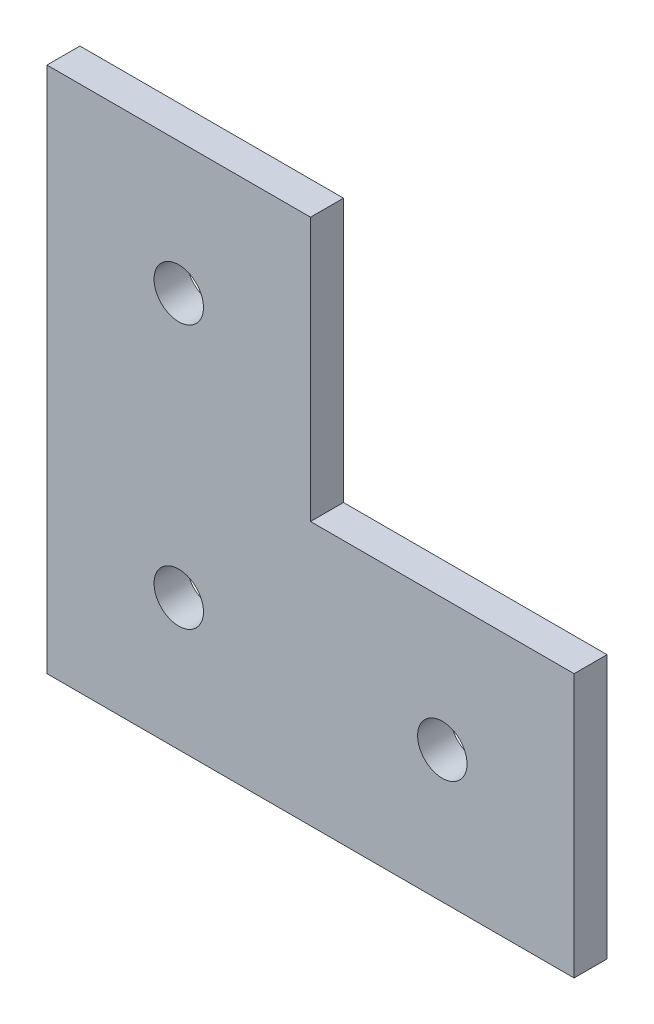
ISO-10303-21;
HEADER;
FILE_DESCRIPTION(('STEP AP214'),'2;1');
FILE_NAME('part.step','',(''),(''),'','','');
FILE_SCHEMA(('AUTOMOTIVE_DESIGN { 1 0 10303 214 1 1 1 1 }'));
ENDSEC;
DATA;
#1=APPLICATION_CONTEXT('core data for automotive mechanical design processes');
#2=APPLICATION_PROTOCOL_DEFINITION('international standard','automotive_design',2000,#1);
#3=PRODUCT_CONTEXT('',#1,'mechanical');
#4=PRODUCT('Part','Part','',(#3));
#5=PRODUCT_RELATED_PRODUCT_CATEGORY('part','',(#4));
#6=PRODUCT_DEFINITION_FORMATION('','',#4);
#7=PRODUCT_DEFINITION_CONTEXT('part definition',#1,'design');
#8=PRODUCT_DEFINITION('design','',#6,#7);
#9=PRODUCT_DEFINITION_SHAPE('','',#8);
#10=(LENGTH_UNIT() NAMED_UNIT(*) SI_UNIT(.MILLI.,.METRE.));
#11=(NAMED_UNIT(*) PLANE_ANGLE_UNIT() SI_UNIT($,.RADIAN.));
#12=(NAMED_UNIT(*) SI_UNIT($,.STERADIAN.) SOLID_ANGLE_UNIT());
#13=UNCERTAINTY_MEASURE_WITH_UNIT(LENGTH_MEASURE(1.E-05),#10,'distance_accuracy_value','');
#14=(GEOMETRIC_REPRESENTATION_CONTEXT(3) GLOBAL_UNCERTAINTY_ASSIGNED_CONTEXT((#13)) GLOBAL_UNIT_ASSIGNED_CONTEXT((#10,
#11,#12)) REPRESENTATION_CONTEXT('',''));
#15=CARTESIAN_POINT('',(0.,0.,0.));
#16=DIRECTION('',(0.,0.,1.));
#17=DIRECTION('',(1.,0.,0.));
#18=AXIS2_PLACEMENT_3D('',#15,#16,#17);
#19=CARTESIAN_POINT('',(25.4,0.,3.175));
#20=DIRECTION('',(1.,0.,0.));
#21=DIRECTION('',(0.,1.,0.));
#22=AXIS2_PLACEMENT_3D('',#19,#20,#21);
#23=PLANE('',#22);
#24=DIRECTION('',(0.,-1.,0.));
#25=VECTOR('',#24,1.);
#26=CARTESIAN_POINT('',(25.4,0.,0.));
#27=LINE('',#26,#25);
#28=CARTESIAN_POINT('',(25.4,50.8,0.));
#29=VERTEX_POINT('',#28);
#30=CARTESIAN_POINT('',(25.4,25.4,0.));
#31=VERTEX_POINT('',#30);
#32=EDGE_CURVE('E133',#29,#31,#27,.T.);
#33=ORIENTED_EDGE('',*,*,#32,.F.);
#34=DIRECTION('',(0.,0.,-1.));
#35=VECTOR('',#34,1.);
#36=CARTESIAN_POINT('',(25.4,50.8,3.175));
#37=LINE('',#36,#35);
#38=CARTESIAN_POINT('',(25.4,50.8,3.175));
#39=VERTEX_POINT('',#38);
#40=EDGE_CURVE('E11',#39,#29,#37,.T.);
#41=ORIENTED_EDGE('',*,*,#40,.F.);
#42=DIRECTION('',(0.,-1.,0.));
#43=VECTOR('',#42,1.);
#44=CARTESIAN_POINT('',(25.4,0.,3.175));
#45=LINE('',#44,#43);
#46=CARTESIAN_POINT('',(25.4,25.4,3.175));
#47=VERTEX_POINT('',#46);
#48=EDGE_CURVE('E279',#39,#47,#45,.T.);
#49=ORIENTED_EDGE('',*,*,#48,.T.);
#50=DIRECTION('',(0.,0.,-1.));
#51=VECTOR('',#50,1.);
#52=CARTESIAN_POINT('',(25.4,25.4,3.175));
#53=LINE('',#52,#51);
#54=EDGE_CURVE('E83',#47,#31,#53,.T.);
#55=ORIENTED_EDGE('',*,*,#54,.T.);
#56=EDGE_LOOP('',(#33,#41,#49,#55));
#57=FACE_BOUND('',#56,.T.);
#58=ADVANCED_FACE('F38',(#57),#23,.T.);
#59=CARTESIAN_POINT('',(0.,50.8,3.175));
#60=DIRECTION('',(0.,1.,0.));
#61=DIRECTION('',(0.,0.,1.));
#62=AXIS2_PLACEMENT_3D('',#59,#60,#61);
#63=PLANE('',#62);
#64=DIRECTION('',(1.,0.,0.));
#65=VECTOR('',#64,1.);
#66=CARTESIAN_POINT('',(0.,50.8,0.));
#67=LINE('',#66,#65);
#68=CARTESIAN_POINT('',(0.,50.8,0.));
#69=VERTEX_POINT('',#68);
#70=EDGE_CURVE('E131',#69,#29,#67,.T.);
#71=ORIENTED_EDGE('',*,*,#70,.F.);
#72=DIRECTION('',(0.,0.,-1.));
#73=VECTOR('',#72,1.);
#74=CARTESIAN_POINT('',(0.,50.8,3.175));
#75=LINE('',#74,#73);
#76=CARTESIAN_POINT('',(0.,50.8,3.175));
#77=VERTEX_POINT('',#76);
#78=EDGE_CURVE('E47',#77,#69,#75,.T.);
#79=ORIENTED_EDGE('',*,*,#78,.F.);
#80=DIRECTION('',(1.,0.,0.));
#81=VECTOR('',#80,1.);
#82=CARTESIAN_POINT('',(0.,50.8,3.175));
#83=LINE('',#82,#81);
#84=EDGE_CURVE('E280',#77,#39,#83,.T.);
#85=ORIENTED_EDGE('',*,*,#84,.T.);
#86=ORIENTED_EDGE('',*,*,#40,.T.);
#87=EDGE_LOOP('',(#71,#79,#85,#86));
#88=FACE_BOUND('',#87,.T.);
#89=ADVANCED_FACE('F132',(#88),#63,.T.);
#90=CARTESIAN_POINT('',(0.,0.,3.175));
#91=DIRECTION('',(-1.,0.,0.));
#92=DIRECTION('',(0.,0.,1.));
#93=AXIS2_PLACEMENT_3D('',#90,#91,#92);
#94=PLANE('',#93);
#95=DIRECTION('',(0.,1.,0.));
#96=VECTOR('',#95,1.);
#97=CARTESIAN_POINT('',(0.,0.,0.));
#98=LINE('',#97,#96);
#99=CARTESIAN_POINT('',(0.,0.,0.));
#100=VERTEX_POINT('',#99);
#101=EDGE_CURVE('E127',#100,#69,#98,.T.);
#102=ORIENTED_EDGE('',*,*,#101,.F.);
#103=DIRECTION('',(0.,0.,-1.));
#104=VECTOR('',#103,1.);
#105=CARTESIAN_POINT('',(0.,0.,3.175));
#106=LINE('',#105,#104);
#107=CARTESIAN_POINT('',(0.,0.,3.175));
#108=VERTEX_POINT('',#107);
#109=EDGE_CURVE('E117',#108,#100,#106,.T.);
#110=ORIENTED_EDGE('',*,*,#109,.F.);
#111=DIRECTION('',(0.,1.,0.));
#112=VECTOR('',#111,1.);
#113=CARTESIAN_POINT('',(0.,0.,3.175));
#114=LINE('',#113,#112);
#115=EDGE_CURVE('E111',#108,#77,#114,.T.);
#116=ORIENTED_EDGE('',*,*,#115,.T.);
#117=ORIENTED_EDGE('',*,*,#78,.T.);
#118=EDGE_LOOP('',(#102,#110,#116,#117));
#119=FACE_BOUND('',#118,.T.);
#120=ADVANCED_FACE('F125',(#119),#94,.T.);
#121=CARTESIAN_POINT('',(0.,0.,3.175));
#122=DIRECTION('',(0.,1.,0.));
#123=DIRECTION('',(0.,0.,1.));
#124=AXIS2_PLACEMENT_3D('',#121,#122,#123);
#125=PLANE('',#124);
#126=DIRECTION('',(1.,0.,0.));
#127=VECTOR('',#126,1.);
#128=CARTESIAN_POINT('',(0.,0.,0.));
#129=LINE('',#128,#127);
#130=CARTESIAN_POINT('',(50.8,0.,0.));
#131=VERTEX_POINT('',#130);
#132=EDGE_CURVE('E116',#100,#131,#129,.T.);
#133=ORIENTED_EDGE('',*,*,#132,.T.);
#134=DIRECTION('',(0.,0.,-1.));
#135=VECTOR('',#134,1.);
#136=CARTESIAN_POINT('',(50.8,0.,3.175));
#137=LINE('',#136,#135);
#138=CARTESIAN_POINT('',(50.8,0.,3.175));
#139=VERTEX_POINT('',#138);
#140=EDGE_CURVE('E101',#139,#131,#137,.T.);
#141=ORIENTED_EDGE('',*,*,#140,.F.);
#142=DIRECTION('',(1.,0.,0.));
#143=VECTOR('',#142,1.);
#144=CARTESIAN_POINT('',(0.,0.,3.175));
#145=LINE('',#144,#143);
#146=EDGE_CURVE('E104',#108,#139,#145,.T.);
#147=ORIENTED_EDGE('',*,*,#146,.F.);
#148=ORIENTED_EDGE('',*,*,#109,.T.);
#149=EDGE_LOOP('',(#133,#141,#147,#148));
#150=FACE_BOUND('',#149,.T.);
#151=ADVANCED_FACE('F114',(#150),#125,.F.);
#152=CARTESIAN_POINT('',(50.8,0.,3.175));
#153=DIRECTION('',(-1.,0.,0.));
#154=DIRECTION('',(0.,0.,1.));
#155=AXIS2_PLACEMENT_3D('',#152,#153,#154);
#156=PLANE('',#155);
#157=DIRECTION('',(0.,1.,0.));
#158=VECTOR('',#157,1.);
#159=CARTESIAN_POINT('',(50.8,0.,0.));
#160=LINE('',#159,#158);
#161=CARTESIAN_POINT('',(50.8,25.4,0.));
#162=VERTEX_POINT('',#161);
#163=EDGE_CURVE('E137',#131,#162,#160,.T.);
#164=ORIENTED_EDGE('',*,*,#163,.T.);
#165=DIRECTION('',(0.,0.,-1.));
#166=VECTOR('',#165,1.);
#167=CARTESIAN_POINT('',(50.8,25.4,3.175));
#168=LINE('',#167,#166);
#169=CARTESIAN_POINT('',(50.8,25.4,3.175));
#170=VERTEX_POINT('',#169);
#171=EDGE_CURVE('E103',#170,#162,#168,.T.);
#172=ORIENTED_EDGE('',*,*,#171,.F.);
#173=DIRECTION('',(0.,1.,0.));
#174=VECTOR('',#173,1.);
#175=CARTESIAN_POINT('',(50.8,0.,3.175));
#176=LINE('',#175,#174);
#177=EDGE_CURVE('E96',#139,#170,#176,.T.);
#178=ORIENTED_EDGE('',*,*,#177,.F.);
#179=ORIENTED_EDGE('',*,*,#140,.T.);
#180=EDGE_LOOP('',(#164,#172,#178,#179));
#181=FACE_BOUND('',#180,.T.);
#182=ADVANCED_FACE('F99',(#181),#156,.F.);
#183=CARTESIAN_POINT('',(12.7,12.7,3.175));
#184=DIRECTION('',(0.,0.,-1.));
#185=DIRECTION('',(-1.,0.,0.));
#186=AXIS2_PLACEMENT_3D('',#183,#184,#185);
#187=CYLINDRICAL_SURFACE('',#186,2.38125);
#188=CARTESIAN_POINT('',(12.7,12.7,3.175));
#189=DIRECTION('',(0.,0.,1.));
#190=DIRECTION('',(1.,0.,0.));
#191=AXIS2_PLACEMENT_3D('',#188,#189,#190);
#192=CIRCLE('',#191,2.38125);
#193=CARTESIAN_POINT('',(15.08125,12.7,3.175));
#194=VERTEX_POINT('',#193);
#195=EDGE_CURVE('E281',#194,#194,#192,.T.);
#196=ORIENTED_EDGE('',*,*,#195,.T.);
#197=EDGE_LOOP('',(#196));
#198=FACE_BOUND('',#197,.T.);
#199=CARTESIAN_POINT('',(12.7,12.7,0.));
#200=DIRECTION('',(0.,0.,1.));
#201=DIRECTION('',(1.,0.,0.));
#202=AXIS2_PLACEMENT_3D('',#199,#200,#201);
#203=CIRCLE('',#202,2.38125);
#204=CARTESIAN_POINT('',(15.08125,12.7,0.));
#205=VERTEX_POINT('',#204);
#206=EDGE_CURVE('E151',#205,#205,#203,.T.);
#207=ORIENTED_EDGE('',*,*,#206,.F.);
#208=EDGE_LOOP('',(#207));
#209=FACE_BOUND('',#208,.T.);
#210=ADVANCED_FACE('F161',(#198,#209),#187,.F.);
#211=CARTESIAN_POINT('',(38.1,12.7,3.175));
#212=DIRECTION('',(0.,0.,-1.));
#213=DIRECTION('',(-1.,0.,0.));
#214=AXIS2_PLACEMENT_3D('',#211,#212,#213);
#215=CYLINDRICAL_SURFACE('',#214,2.38125000000001);
#216=CARTESIAN_POINT('',(38.1,12.7,3.175));
#217=DIRECTION('',(0.,0.,1.));
#218=DIRECTION('',(1.,0.,0.));
#219=AXIS2_PLACEMENT_3D('',#216,#217,#218);
#220=CIRCLE('',#219,2.38125000000001);
#221=CARTESIAN_POINT('',(40.48125,12.7,3.175));
#222=VERTEX_POINT('',#221);
#223=EDGE_CURVE('E175',#222,#222,#220,.T.);
#224=ORIENTED_EDGE('',*,*,#223,.T.);
#225=EDGE_LOOP('',(#224));
#226=FACE_BOUND('',#225,.T.);
#227=CARTESIAN_POINT('',(38.1,12.7,0.));
#228=DIRECTION('',(0.,0.,1.));
#229=DIRECTION('',(1.,0.,0.));
#230=AXIS2_PLACEMENT_3D('',#227,#228,#229);
#231=CIRCLE('',#230,2.38125000000001);
#232=CARTESIAN_POINT('',(40.48125,12.7,0.));
#233=VERTEX_POINT('',#232);
#234=EDGE_CURVE('E148',#233,#233,#231,.T.);
#235=ORIENTED_EDGE('',*,*,#234,.F.);
#236=EDGE_LOOP('',(#235));
#237=FACE_BOUND('',#236,.T.);
#238=ADVANCED_FACE('F163',(#226,#237),#215,.F.);
#239=CARTESIAN_POINT('',(12.6999999999999,38.1,3.175));
#240=DIRECTION('',(0.,0.,-1.));
#241=DIRECTION('',(-1.,0.,0.));
#242=AXIS2_PLACEMENT_3D('',#239,#240,#241);
#243=CYLINDRICAL_SURFACE('',#242,2.38125);
#244=CARTESIAN_POINT('',(12.6999999999999,38.1,3.175));
#245=DIRECTION('',(0.,0.,1.));
#246=DIRECTION('',(1.,0.,0.));
#247=AXIS2_PLACEMENT_3D('',#244,#245,#246);
#248=CIRCLE('',#247,2.38125);
#249=CARTESIAN_POINT('',(15.0812499999999,38.1,3.175));
#250=VERTEX_POINT('',#249);
#251=EDGE_CURVE('E142',#250,#250,#248,.T.);
#252=ORIENTED_EDGE('',*,*,#251,.T.);
#253=EDGE_LOOP('',(#252));
#254=FACE_BOUND('',#253,.T.);
#255=CARTESIAN_POINT('',(12.6999999999999,38.1,0.));
#256=DIRECTION('',(0.,0.,1.));
#257=DIRECTION('',(1.,0.,0.));
#258=AXIS2_PLACEMENT_3D('',#255,#256,#257);
#259=CIRCLE('',#258,2.38125);
#260=CARTESIAN_POINT('',(15.0812499999999,38.1,0.));
#261=VERTEX_POINT('',#260);
#262=EDGE_CURVE('E145',#261,#261,#259,.T.);
#263=ORIENTED_EDGE('',*,*,#262,.F.);
#264=EDGE_LOOP('',(#263));
#265=FACE_BOUND('',#264,.T.);
#266=ADVANCED_FACE('F40',(#254,#265),#243,.F.);
#267=CARTESIAN_POINT('',(0.,25.4,3.175));
#268=DIRECTION('',(0.,-1.,0.));
#269=DIRECTION('',(1.,0.,0.));
#270=AXIS2_PLACEMENT_3D('',#267,#268,#269);
#271=PLANE('',#270);
#272=DIRECTION('',(-1.,0.,0.));
#273=VECTOR('',#272,1.);
#274=CARTESIAN_POINT('',(0.,25.4,0.));
#275=LINE('',#274,#273);
#276=EDGE_CURVE('E76',#162,#31,#275,.T.);
#277=ORIENTED_EDGE('',*,*,#276,.T.);
#278=ORIENTED_EDGE('',*,*,#54,.F.);
#279=DIRECTION('',(-1.,0.,0.));
#280=VECTOR('',#279,1.);
#281=CARTESIAN_POINT('',(0.,25.4,3.175));
#282=LINE('',#281,#280);
#283=EDGE_CURVE('E55',#170,#47,#282,.T.);
#284=ORIENTED_EDGE('',*,*,#283,.F.);
#285=ORIENTED_EDGE('',*,*,#171,.T.);
#286=EDGE_LOOP('',(#277,#278,#284,#285));
#287=FACE_BOUND('',#286,.T.);
#288=ADVANCED_FACE('F170',(#287),#271,.F.);
#289=CARTESIAN_POINT('',(0.,0.,3.175));
#290=DIRECTION('',(0.,0.,1.));
#291=DIRECTION('',(1.,0.,0.));
#292=AXIS2_PLACEMENT_3D('',#289,#290,#291);
#293=PLANE('',#292);
#294=ORIENTED_EDGE('',*,*,#251,.F.);
#295=EDGE_LOOP('',(#294));
#296=FACE_BOUND('',#295,.T.);
#297=ORIENTED_EDGE('',*,*,#223,.F.);
#298=EDGE_LOOP('',(#297));
#299=FACE_BOUND('',#298,.T.);
#300=ORIENTED_EDGE('',*,*,#195,.F.);
#301=EDGE_LOOP('',(#300));
#302=FACE_BOUND('',#301,.T.);
#303=ORIENTED_EDGE('',*,*,#48,.F.);
#304=ORIENTED_EDGE('',*,*,#84,.F.);
#305=ORIENTED_EDGE('',*,*,#115,.F.);
#306=ORIENTED_EDGE('',*,*,#146,.T.);
#307=ORIENTED_EDGE('',*,*,#177,.T.);
#308=ORIENTED_EDGE('',*,*,#283,.T.);
#309=EDGE_LOOP('',(#303,#304,#305,#306,#307,#308));
#310=FACE_BOUND('',#309,.T.);
#311=ADVANCED_FACE('F108',(#296,#299,#302,#310),#293,.T.);
#312=CARTESIAN_POINT('',(0.,0.,0.));
#313=DIRECTION('',(0.,0.,1.));
#314=DIRECTION('',(1.,0.,0.));
#315=AXIS2_PLACEMENT_3D('',#312,#313,#314);
#316=PLANE('',#315);
#317=ORIENTED_EDGE('',*,*,#262,.T.);
#318=EDGE_LOOP('',(#317));
#319=FACE_BOUND('',#318,.T.);
#320=ORIENTED_EDGE('',*,*,#234,.T.);
#321=EDGE_LOOP('',(#320));
#322=FACE_BOUND('',#321,.T.);
#323=ORIENTED_EDGE('',*,*,#206,.T.);
#324=EDGE_LOOP('',(#323));
#325=FACE_BOUND('',#324,.T.);
#326=ORIENTED_EDGE('',*,*,#32,.T.);
#327=ORIENTED_EDGE('',*,*,#276,.F.);
#328=ORIENTED_EDGE('',*,*,#163,.F.);
#329=ORIENTED_EDGE('',*,*,#132,.F.);
#330=ORIENTED_EDGE('',*,*,#101,.T.);
#331=ORIENTED_EDGE('',*,*,#70,.T.);
#332=EDGE_LOOP('',(#326,#327,#328,#329,#330,#331));
#333=FACE_BOUND('',#332,.T.);
#334=ADVANCED_FACE('F135',(#319,#322,#325,#333),#316,.F.);
#335=CLOSED_SHELL('',(#58,#89,#120,#151,#182,#210,#238,#266,#288,#311,#334));
#336=MANIFOLD_SOLID_BREP('B2',#335);
#337=ADVANCED_BREP_SHAPE_REPRESENTATION('',(#18,#336),#14);
#338=SHAPE_DEFINITION_REPRESENTATION(#9,#337);
ENDSEC;
END-ISO-10303-21;
